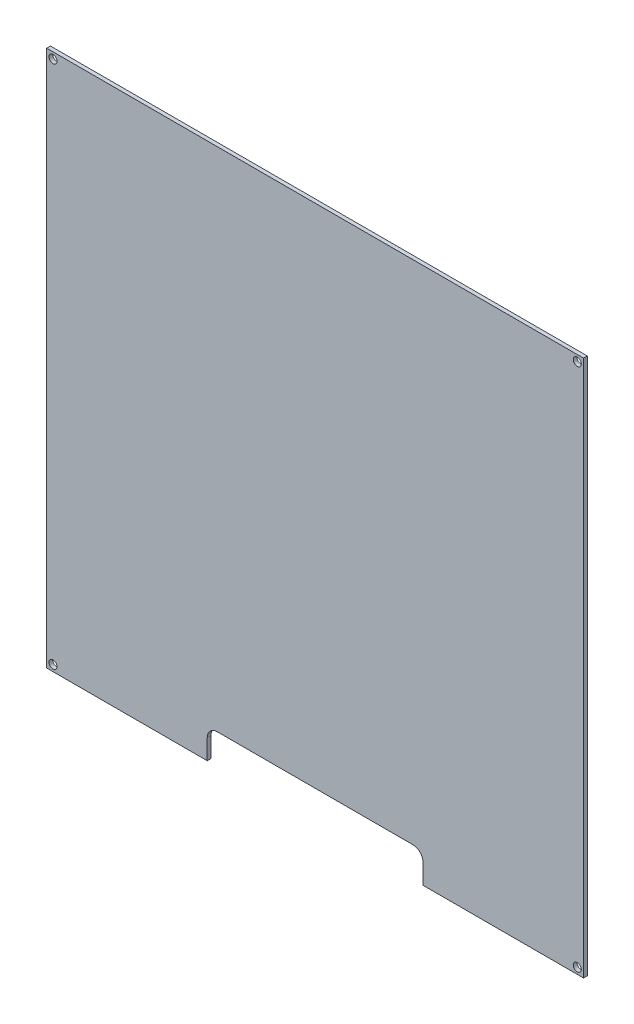
ISO-10303-21;
HEADER;
FILE_DESCRIPTION(('STEP AP214'),'2;1');
FILE_NAME('part.step','',(''),(''),'','','');
FILE_SCHEMA(('AUTOMOTIVE_DESIGN { 1 0 10303 214 1 1 1 1 }'));
ENDSEC;
DATA;
#1=APPLICATION_CONTEXT('core data for automotive mechanical design processes');
#2=APPLICATION_PROTOCOL_DEFINITION('international standard','automotive_design',2000,#1);
#3=PRODUCT_CONTEXT('',#1,'mechanical');
#4=PRODUCT('Part','Part','',(#3));
#5=PRODUCT_RELATED_PRODUCT_CATEGORY('part','',(#4));
#6=PRODUCT_DEFINITION_FORMATION('','',#4);
#7=PRODUCT_DEFINITION_CONTEXT('part definition',#1,'design');
#8=PRODUCT_DEFINITION('design','',#6,#7);
#9=PRODUCT_DEFINITION_SHAPE('','',#8);
#10=(LENGTH_UNIT() NAMED_UNIT(*) SI_UNIT(.MILLI.,.METRE.));
#11=(NAMED_UNIT(*) PLANE_ANGLE_UNIT() SI_UNIT($,.RADIAN.));
#12=(NAMED_UNIT(*) SI_UNIT($,.STERADIAN.) SOLID_ANGLE_UNIT());
#13=UNCERTAINTY_MEASURE_WITH_UNIT(LENGTH_MEASURE(1.E-05),#10,'distance_accuracy_value','');
#14=(GEOMETRIC_REPRESENTATION_CONTEXT(3) GLOBAL_UNCERTAINTY_ASSIGNED_CONTEXT((#13)) GLOBAL_UNIT_ASSIGNED_CONTEXT((#10,
#11,#12)) REPRESENTATION_CONTEXT('',''));
#15=CARTESIAN_POINT('',(0.,0.,0.));
#16=DIRECTION('',(0.,0.,1.));
#17=DIRECTION('',(1.,0.,0.));
#18=AXIS2_PLACEMENT_3D('',#15,#16,#17);
#19=CARTESIAN_POINT('',(-107.,-107.,1.5));
#20=DIRECTION('',(0.,1.,0.));
#21=DIRECTION('',(0.,0.,1.));
#22=AXIS2_PLACEMENT_3D('',#19,#20,#21);
#23=PLANE('',#22);
#24=DIRECTION('',(1.,0.,0.));
#25=VECTOR('',#24,1.);
#26=CARTESIAN_POINT('',(-107.,-107.,0.));
#27=LINE('',#26,#25);
#28=CARTESIAN_POINT('',(-107.,-107.,0.));
#29=VERTEX_POINT('',#28);
#30=CARTESIAN_POINT('',(-43.,-107.,0.));
#31=VERTEX_POINT('',#30);
#32=EDGE_CURVE('E114',#29,#31,#27,.T.);
#33=ORIENTED_EDGE('',*,*,#32,.T.);
#34=DIRECTION('',(0.,0.,1.));
#35=VECTOR('',#34,1.);
#36=CARTESIAN_POINT('',(-43.,-107.,0.));
#37=LINE('',#36,#35);
#38=CARTESIAN_POINT('',(-43.,-107.,1.5));
#39=VERTEX_POINT('',#38);
#40=EDGE_CURVE('E120',#31,#39,#37,.T.);
#41=ORIENTED_EDGE('',*,*,#40,.T.);
#42=DIRECTION('',(1.,0.,0.));
#43=VECTOR('',#42,1.);
#44=CARTESIAN_POINT('',(-107.,-107.,1.5));
#45=LINE('',#44,#43);
#46=CARTESIAN_POINT('',(-107.,-107.,1.5));
#47=VERTEX_POINT('',#46);
#48=EDGE_CURVE('E146',#47,#39,#45,.T.);
#49=ORIENTED_EDGE('',*,*,#48,.F.);
#50=DIRECTION('',(0.,0.,-1.));
#51=VECTOR('',#50,1.);
#52=CARTESIAN_POINT('',(-107.,-107.,1.5));
#53=LINE('',#52,#51);
#54=EDGE_CURVE('E132',#47,#29,#53,.T.);
#55=ORIENTED_EDGE('',*,*,#54,.T.);
#56=EDGE_LOOP('',(#33,#41,#49,#55));
#57=FACE_BOUND('',#56,.T.);
#58=ADVANCED_FACE('F34',(#57),#23,.F.);
#59=CARTESIAN_POINT('',(0.,0.,1.5));
#60=DIRECTION('',(0.,0.,-1.));
#61=DIRECTION('',(-1.,0.,0.));
#62=AXIS2_PLACEMENT_3D('',#59,#60,#61);
#63=PLANE('',#62);
#64=CARTESIAN_POINT('',(104.5,-104.5,1.5));
#65=DIRECTION('',(0.,0.,1.));
#66=DIRECTION('',(-1.,0.,0.));
#67=AXIS2_PLACEMENT_3D('',#64,#65,#66);
#68=CIRCLE('',#67,1.60000000000001);
#69=CARTESIAN_POINT('',(102.9,-104.5,1.5));
#70=VERTEX_POINT('',#69);
#71=EDGE_CURVE('E240',#70,#70,#68,.T.);
#72=ORIENTED_EDGE('',*,*,#71,.F.);
#73=EDGE_LOOP('',(#72));
#74=FACE_BOUND('',#73,.T.);
#75=CARTESIAN_POINT('',(104.5,104.5,1.5));
#76=DIRECTION('',(0.,0.,1.));
#77=DIRECTION('',(1.,0.,0.));
#78=AXIS2_PLACEMENT_3D('',#75,#76,#77);
#79=CIRCLE('',#78,1.60000000000001);
#80=CARTESIAN_POINT('',(106.1,104.5,1.5));
#81=VERTEX_POINT('',#80);
#82=EDGE_CURVE('E234',#81,#81,#79,.T.);
#83=ORIENTED_EDGE('',*,*,#82,.F.);
#84=EDGE_LOOP('',(#83));
#85=FACE_BOUND('',#84,.T.);
#86=ORIENTED_EDGE('',*,*,#48,.T.);
#87=DIRECTION('',(0.,-1.,0.));
#88=VECTOR('',#87,1.);
#89=CARTESIAN_POINT('',(-43.,-107.,1.5));
#90=LINE('',#89,#88);
#91=CARTESIAN_POINT('',(-43.,-99.,1.5));
#92=VERTEX_POINT('',#91);
#93=EDGE_CURVE('E123',#92,#39,#90,.T.);
#94=ORIENTED_EDGE('',*,*,#93,.F.);
#95=CARTESIAN_POINT('',(-39.,-99.,1.5));
#96=DIRECTION('',(0.,0.,-1.));
#97=DIRECTION('',(-1.,0.,0.));
#98=AXIS2_PLACEMENT_3D('',#95,#96,#97);
#99=CIRCLE('',#98,4.);
#100=CARTESIAN_POINT('',(-39.,-95.,1.5));
#101=VERTEX_POINT('',#100);
#102=EDGE_CURVE('E42',#92,#101,#99,.T.);
#103=ORIENTED_EDGE('',*,*,#102,.T.);
#104=DIRECTION('',(-1.,0.,0.));
#105=VECTOR('',#104,1.);
#106=CARTESIAN_POINT('',(-43.,-95.,1.5));
#107=LINE('',#106,#105);
#108=CARTESIAN_POINT('',(39.,-95.,1.5));
#109=VERTEX_POINT('',#108);
#110=EDGE_CURVE('E117',#109,#101,#107,.T.);
#111=ORIENTED_EDGE('',*,*,#110,.F.);
#112=CARTESIAN_POINT('',(39.,-99.,1.5));
#113=DIRECTION('',(0.,0.,-1.));
#114=DIRECTION('',(-1.,0.,0.));
#115=AXIS2_PLACEMENT_3D('',#112,#113,#114);
#116=CIRCLE('',#115,4.);
#117=CARTESIAN_POINT('',(43.,-99.,1.5));
#118=VERTEX_POINT('',#117);
#119=EDGE_CURVE('E163',#109,#118,#116,.T.);
#120=ORIENTED_EDGE('',*,*,#119,.T.);
#121=DIRECTION('',(0.,1.,0.));
#122=VECTOR('',#121,1.);
#123=CARTESIAN_POINT('',(43.,-107.,1.5));
#124=LINE('',#123,#122);
#125=CARTESIAN_POINT('',(43.,-107.,1.5));
#126=VERTEX_POINT('',#125);
#127=EDGE_CURVE('E175',#126,#118,#124,.T.);
#128=ORIENTED_EDGE('',*,*,#127,.F.);
#129=CARTESIAN_POINT('',(107.,-107.,1.5));
#130=VERTEX_POINT('',#129);
#131=EDGE_CURVE('E210',#126,#130,#45,.T.);
#132=ORIENTED_EDGE('',*,*,#131,.T.);
#133=DIRECTION('',(0.,1.,0.));
#134=VECTOR('',#133,1.);
#135=CARTESIAN_POINT('',(107.,-107.,1.5));
#136=LINE('',#135,#134);
#137=CARTESIAN_POINT('',(107.,107.,1.5));
#138=VERTEX_POINT('',#137);
#139=EDGE_CURVE('E133',#130,#138,#136,.T.);
#140=ORIENTED_EDGE('',*,*,#139,.T.);
#141=DIRECTION('',(-1.,0.,0.));
#142=VECTOR('',#141,1.);
#143=CARTESIAN_POINT('',(-107.,107.,1.5));
#144=LINE('',#143,#142);
#145=CARTESIAN_POINT('',(-107.,107.,1.5));
#146=VERTEX_POINT('',#145);
#147=EDGE_CURVE('E137',#138,#146,#144,.T.);
#148=ORIENTED_EDGE('',*,*,#147,.T.);
#149=DIRECTION('',(0.,-1.,0.));
#150=VECTOR('',#149,1.);
#151=CARTESIAN_POINT('',(-107.,-107.,1.5));
#152=LINE('',#151,#150);
#153=EDGE_CURVE('E214',#146,#47,#152,.T.);
#154=ORIENTED_EDGE('',*,*,#153,.T.);
#155=EDGE_LOOP('',(#86,#94,#103,#111,#120,#128,#132,#140,#148,#154));
#156=FACE_BOUND('',#155,.T.);
#157=CARTESIAN_POINT('',(-104.5,104.5,1.5));
#158=DIRECTION('',(0.,0.,1.));
#159=DIRECTION('',(1.,0.,0.));
#160=AXIS2_PLACEMENT_3D('',#157,#158,#159);
#161=CIRCLE('',#160,1.60000000000001);
#162=CARTESIAN_POINT('',(-102.9,104.5,1.5));
#163=VERTEX_POINT('',#162);
#164=EDGE_CURVE('E222',#163,#163,#161,.T.);
#165=ORIENTED_EDGE('',*,*,#164,.F.);
#166=EDGE_LOOP('',(#165));
#167=FACE_BOUND('',#166,.T.);
#168=CARTESIAN_POINT('',(-104.5,-104.5,1.5));
#169=DIRECTION('',(0.,0.,1.));
#170=DIRECTION('',(-1.,0.,0.));
#171=AXIS2_PLACEMENT_3D('',#168,#169,#170);
#172=CIRCLE('',#171,1.60000000000001);
#173=CARTESIAN_POINT('',(-106.1,-104.5,1.5));
#174=VERTEX_POINT('',#173);
#175=EDGE_CURVE('E246',#174,#174,#172,.T.);
#176=ORIENTED_EDGE('',*,*,#175,.F.);
#177=EDGE_LOOP('',(#176));
#178=FACE_BOUND('',#177,.T.);
#179=ADVANCED_FACE('F169',(#74,#85,#156,#167,#178),#63,.F.);
#180=CARTESIAN_POINT('',(0.,0.,0.));
#181=DIRECTION('',(0.,0.,-1.));
#182=DIRECTION('',(-1.,0.,0.));
#183=AXIS2_PLACEMENT_3D('',#180,#181,#182);
#184=PLANE('',#183);
#185=DIRECTION('',(-1.,0.,0.));
#186=VECTOR('',#185,1.);
#187=CARTESIAN_POINT('',(-43.,-95.,0.));
#188=LINE('',#187,#186);
#189=CARTESIAN_POINT('',(39.,-95.,0.));
#190=VERTEX_POINT('',#189);
#191=CARTESIAN_POINT('',(-39.,-95.,0.));
#192=VERTEX_POINT('',#191);
#193=EDGE_CURVE('E128',#190,#192,#188,.T.);
#194=ORIENTED_EDGE('',*,*,#193,.T.);
#195=CARTESIAN_POINT('',(-39.,-99.,0.));
#196=DIRECTION('',(0.,0.,-1.));
#197=DIRECTION('',(-1.,0.,0.));
#198=AXIS2_PLACEMENT_3D('',#195,#196,#197);
#199=CIRCLE('',#198,4.);
#200=CARTESIAN_POINT('',(-43.,-99.,0.));
#201=VERTEX_POINT('',#200);
#202=EDGE_CURVE('E11',#192,#201,#199,.F.);
#203=ORIENTED_EDGE('',*,*,#202,.T.);
#204=DIRECTION('',(0.,-1.,0.));
#205=VECTOR('',#204,1.);
#206=CARTESIAN_POINT('',(-43.,-107.,0.));
#207=LINE('',#206,#205);
#208=EDGE_CURVE('E108',#201,#31,#207,.T.);
#209=ORIENTED_EDGE('',*,*,#208,.T.);
#210=ORIENTED_EDGE('',*,*,#32,.F.);
#211=DIRECTION('',(0.,-1.,0.));
#212=VECTOR('',#211,1.);
#213=CARTESIAN_POINT('',(-107.,-107.,0.));
#214=LINE('',#213,#212);
#215=CARTESIAN_POINT('',(-107.,107.,0.));
#216=VERTEX_POINT('',#215);
#217=EDGE_CURVE('E139',#216,#29,#214,.T.);
#218=ORIENTED_EDGE('',*,*,#217,.F.);
#219=DIRECTION('',(-1.,0.,0.));
#220=VECTOR('',#219,1.);
#221=CARTESIAN_POINT('',(-107.,107.,0.));
#222=LINE('',#221,#220);
#223=CARTESIAN_POINT('',(107.,107.,0.));
#224=VERTEX_POINT('',#223);
#225=EDGE_CURVE('E221',#224,#216,#222,.T.);
#226=ORIENTED_EDGE('',*,*,#225,.F.);
#227=DIRECTION('',(0.,1.,0.));
#228=VECTOR('',#227,1.);
#229=CARTESIAN_POINT('',(107.,-107.,0.));
#230=LINE('',#229,#228);
#231=CARTESIAN_POINT('',(107.,-107.,0.));
#232=VERTEX_POINT('',#231);
#233=EDGE_CURVE('E219',#232,#224,#230,.T.);
#234=ORIENTED_EDGE('',*,*,#233,.F.);
#235=CARTESIAN_POINT('',(43.,-107.,0.));
#236=VERTEX_POINT('',#235);
#237=EDGE_CURVE('E134',#236,#232,#27,.T.);
#238=ORIENTED_EDGE('',*,*,#237,.F.);
#239=DIRECTION('',(0.,1.,0.));
#240=VECTOR('',#239,1.);
#241=CARTESIAN_POINT('',(43.,-107.,0.));
#242=LINE('',#241,#240);
#243=CARTESIAN_POINT('',(43.,-99.,0.));
#244=VERTEX_POINT('',#243);
#245=EDGE_CURVE('E116',#236,#244,#242,.T.);
#246=ORIENTED_EDGE('',*,*,#245,.T.);
#247=CARTESIAN_POINT('',(39.,-99.,0.));
#248=DIRECTION('',(0.,0.,-1.));
#249=DIRECTION('',(-1.,0.,0.));
#250=AXIS2_PLACEMENT_3D('',#247,#248,#249);
#251=CIRCLE('',#250,4.);
#252=EDGE_CURVE('E165',#244,#190,#251,.F.);
#253=ORIENTED_EDGE('',*,*,#252,.T.);
#254=EDGE_LOOP('',(#194,#203,#209,#210,#218,#226,#234,#238,#246,#253));
#255=FACE_BOUND('',#254,.T.);
#256=CARTESIAN_POINT('',(104.5,-104.5,0.));
#257=DIRECTION('',(0.,0.,1.));
#258=DIRECTION('',(-1.,0.,0.));
#259=AXIS2_PLACEMENT_3D('',#256,#257,#258);
#260=CIRCLE('',#259,1.60000000000001);
#261=CARTESIAN_POINT('',(102.9,-104.5,0.));
#262=VERTEX_POINT('',#261);
#263=EDGE_CURVE('E243',#262,#262,#260,.T.);
#264=ORIENTED_EDGE('',*,*,#263,.T.);
#265=EDGE_LOOP('',(#264));
#266=FACE_BOUND('',#265,.T.);
#267=CARTESIAN_POINT('',(104.5,104.5,0.));
#268=DIRECTION('',(0.,0.,1.));
#269=DIRECTION('',(1.,0.,0.));
#270=AXIS2_PLACEMENT_3D('',#267,#268,#269);
#271=CIRCLE('',#270,1.60000000000001);
#272=CARTESIAN_POINT('',(106.1,104.5,0.));
#273=VERTEX_POINT('',#272);
#274=EDGE_CURVE('E237',#273,#273,#271,.T.);
#275=ORIENTED_EDGE('',*,*,#274,.T.);
#276=EDGE_LOOP('',(#275));
#277=FACE_BOUND('',#276,.T.);
#278=CARTESIAN_POINT('',(-104.5,104.5,0.));
#279=DIRECTION('',(0.,0.,1.));
#280=DIRECTION('',(1.,0.,0.));
#281=AXIS2_PLACEMENT_3D('',#278,#279,#280);
#282=CIRCLE('',#281,1.60000000000001);
#283=CARTESIAN_POINT('',(-102.9,104.5,0.));
#284=VERTEX_POINT('',#283);
#285=EDGE_CURVE('E231',#284,#284,#282,.T.);
#286=ORIENTED_EDGE('',*,*,#285,.T.);
#287=EDGE_LOOP('',(#286));
#288=FACE_BOUND('',#287,.T.);
#289=CARTESIAN_POINT('',(-104.5,-104.5,0.));
#290=DIRECTION('',(0.,0.,1.));
#291=DIRECTION('',(-1.,0.,0.));
#292=AXIS2_PLACEMENT_3D('',#289,#290,#291);
#293=CIRCLE('',#292,1.60000000000001);
#294=CARTESIAN_POINT('',(-106.1,-104.5,0.));
#295=VERTEX_POINT('',#294);
#296=EDGE_CURVE('E249',#295,#295,#293,.T.);
#297=ORIENTED_EDGE('',*,*,#296,.T.);
#298=EDGE_LOOP('',(#297));
#299=FACE_BOUND('',#298,.T.);
#300=ADVANCED_FACE('F110',(#255,#266,#277,#288,#299),#184,.T.);
#301=CARTESIAN_POINT('',(107.,-107.,1.5));
#302=DIRECTION('',(-1.,0.,0.));
#303=DIRECTION('',(0.,0.,1.));
#304=AXIS2_PLACEMENT_3D('',#301,#302,#303);
#305=PLANE('',#304);
#306=ORIENTED_EDGE('',*,*,#233,.T.);
#307=DIRECTION('',(0.,0.,-1.));
#308=VECTOR('',#307,1.);
#309=CARTESIAN_POINT('',(107.,107.,1.5));
#310=LINE('',#309,#308);
#311=EDGE_CURVE('E151',#138,#224,#310,.T.);
#312=ORIENTED_EDGE('',*,*,#311,.F.);
#313=ORIENTED_EDGE('',*,*,#139,.F.);
#314=DIRECTION('',(0.,0.,-1.));
#315=VECTOR('',#314,1.);
#316=CARTESIAN_POINT('',(107.,-107.,1.5));
#317=LINE('',#316,#315);
#318=EDGE_CURVE('E143',#130,#232,#317,.T.);
#319=ORIENTED_EDGE('',*,*,#318,.T.);
#320=EDGE_LOOP('',(#306,#312,#313,#319));
#321=FACE_BOUND('',#320,.T.);
#322=ADVANCED_FACE('F229',(#321),#305,.F.);
#323=CARTESIAN_POINT('',(-107.,107.,1.5));
#324=DIRECTION('',(0.,-1.,0.));
#325=DIRECTION('',(0.,0.,-1.));
#326=AXIS2_PLACEMENT_3D('',#323,#324,#325);
#327=PLANE('',#326);
#328=ORIENTED_EDGE('',*,*,#225,.T.);
#329=DIRECTION('',(0.,0.,-1.));
#330=VECTOR('',#329,1.);
#331=CARTESIAN_POINT('',(-107.,107.,1.5));
#332=LINE('',#331,#330);
#333=EDGE_CURVE('E148',#146,#216,#332,.T.);
#334=ORIENTED_EDGE('',*,*,#333,.F.);
#335=ORIENTED_EDGE('',*,*,#147,.F.);
#336=ORIENTED_EDGE('',*,*,#311,.T.);
#337=EDGE_LOOP('',(#328,#334,#335,#336));
#338=FACE_BOUND('',#337,.T.);
#339=ADVANCED_FACE('F205',(#338),#327,.F.);
#340=CARTESIAN_POINT('',(-107.,-107.,1.5));
#341=DIRECTION('',(1.,0.,0.));
#342=DIRECTION('',(0.,0.,-1.));
#343=AXIS2_PLACEMENT_3D('',#340,#341,#342);
#344=PLANE('',#343);
#345=ORIENTED_EDGE('',*,*,#217,.T.);
#346=ORIENTED_EDGE('',*,*,#54,.F.);
#347=ORIENTED_EDGE('',*,*,#153,.F.);
#348=ORIENTED_EDGE('',*,*,#333,.T.);
#349=EDGE_LOOP('',(#345,#346,#347,#348));
#350=FACE_BOUND('',#349,.T.);
#351=ADVANCED_FACE('F196',(#350),#344,.F.);
#352=ORIENTED_EDGE('',*,*,#131,.F.);
#353=DIRECTION('',(0.,0.,1.));
#354=VECTOR('',#353,1.);
#355=CARTESIAN_POINT('',(43.,-107.,0.));
#356=LINE('',#355,#354);
#357=EDGE_CURVE('E127',#236,#126,#356,.T.);
#358=ORIENTED_EDGE('',*,*,#357,.F.);
#359=ORIENTED_EDGE('',*,*,#237,.T.);
#360=ORIENTED_EDGE('',*,*,#318,.F.);
#361=EDGE_LOOP('',(#352,#358,#359,#360));
#362=FACE_BOUND('',#361,.T.);
#363=ADVANCED_FACE('F186',(#362),#23,.F.);
#364=CARTESIAN_POINT('',(-104.5,104.5,1.5));
#365=DIRECTION('',(0.,0.,-1.));
#366=DIRECTION('',(-1.,0.,0.));
#367=AXIS2_PLACEMENT_3D('',#364,#365,#366);
#368=CYLINDRICAL_SURFACE('',#367,1.60000000000001);
#369=ORIENTED_EDGE('',*,*,#164,.T.);
#370=EDGE_LOOP('',(#369));
#371=FACE_BOUND('',#370,.T.);
#372=ORIENTED_EDGE('',*,*,#285,.F.);
#373=EDGE_LOOP('',(#372));
#374=FACE_BOUND('',#373,.T.);
#375=ADVANCED_FACE('F195',(#371,#374),#368,.F.);
#376=CARTESIAN_POINT('',(104.5,104.5,1.5));
#377=DIRECTION('',(0.,0.,-1.));
#378=DIRECTION('',(-1.,0.,0.));
#379=AXIS2_PLACEMENT_3D('',#376,#377,#378);
#380=CYLINDRICAL_SURFACE('',#379,1.60000000000001);
#381=ORIENTED_EDGE('',*,*,#82,.T.);
#382=EDGE_LOOP('',(#381));
#383=FACE_BOUND('',#382,.T.);
#384=ORIENTED_EDGE('',*,*,#274,.F.);
#385=EDGE_LOOP('',(#384));
#386=FACE_BOUND('',#385,.T.);
#387=ADVANCED_FACE('F202',(#383,#386),#380,.F.);
#388=CARTESIAN_POINT('',(104.5,-104.5,1.5));
#389=DIRECTION('',(0.,0.,-1.));
#390=DIRECTION('',(-1.,0.,0.));
#391=AXIS2_PLACEMENT_3D('',#388,#389,#390);
#392=CYLINDRICAL_SURFACE('',#391,1.60000000000001);
#393=ORIENTED_EDGE('',*,*,#71,.T.);
#394=EDGE_LOOP('',(#393));
#395=FACE_BOUND('',#394,.T.);
#396=ORIENTED_EDGE('',*,*,#263,.F.);
#397=EDGE_LOOP('',(#396));
#398=FACE_BOUND('',#397,.T.);
#399=ADVANCED_FACE('F275',(#395,#398),#392,.F.);
#400=CARTESIAN_POINT('',(-104.5,-104.5,1.5));
#401=DIRECTION('',(0.,0.,-1.));
#402=DIRECTION('',(-1.,0.,0.));
#403=AXIS2_PLACEMENT_3D('',#400,#401,#402);
#404=CYLINDRICAL_SURFACE('',#403,1.60000000000001);
#405=ORIENTED_EDGE('',*,*,#175,.T.);
#406=EDGE_LOOP('',(#405));
#407=FACE_BOUND('',#406,.T.);
#408=ORIENTED_EDGE('',*,*,#296,.F.);
#409=EDGE_LOOP('',(#408));
#410=FACE_BOUND('',#409,.T.);
#411=ADVANCED_FACE('F272',(#407,#410),#404,.F.);
#412=CARTESIAN_POINT('',(-43.,-107.,0.));
#413=DIRECTION('',(-1.,0.,0.));
#414=DIRECTION('',(0.,-1.,0.));
#415=AXIS2_PLACEMENT_3D('',#412,#413,#414);
#416=PLANE('',#415);
#417=ORIENTED_EDGE('',*,*,#208,.F.);
#418=DIRECTION('',(0.,0.,1.));
#419=VECTOR('',#418,1.);
#420=CARTESIAN_POINT('',(-43.,-99.,1.5));
#421=LINE('',#420,#419);
#422=EDGE_CURVE('E161',#201,#92,#421,.T.);
#423=ORIENTED_EDGE('',*,*,#422,.T.);
#424=ORIENTED_EDGE('',*,*,#93,.T.);
#425=ORIENTED_EDGE('',*,*,#40,.F.);
#426=EDGE_LOOP('',(#417,#423,#424,#425));
#427=FACE_BOUND('',#426,.T.);
#428=ADVANCED_FACE('F121',(#427),#416,.F.);
#429=CARTESIAN_POINT('',(-43.,-95.,0.));
#430=DIRECTION('',(0.,1.,0.));
#431=DIRECTION('',(0.,0.,1.));
#432=AXIS2_PLACEMENT_3D('',#429,#430,#431);
#433=PLANE('',#432);
#434=ORIENTED_EDGE('',*,*,#193,.F.);
#435=DIRECTION('',(0.,0.,1.));
#436=VECTOR('',#435,1.);
#437=CARTESIAN_POINT('',(39.,-95.,1.5));
#438=LINE('',#437,#436);
#439=EDGE_CURVE('E156',#190,#109,#438,.T.);
#440=ORIENTED_EDGE('',*,*,#439,.T.);
#441=ORIENTED_EDGE('',*,*,#110,.T.);
#442=DIRECTION('',(0.,0.,1.));
#443=VECTOR('',#442,1.);
#444=CARTESIAN_POINT('',(-39.,-95.,0.));
#445=LINE('',#444,#443);
#446=EDGE_CURVE('E154',#101,#192,#445,.F.);
#447=ORIENTED_EDGE('',*,*,#446,.T.);
#448=EDGE_LOOP('',(#434,#440,#441,#447));
#449=FACE_BOUND('',#448,.T.);
#450=ADVANCED_FACE('F173',(#449),#433,.F.);
#451=CARTESIAN_POINT('',(43.,-107.,0.));
#452=DIRECTION('',(1.,0.,0.));
#453=DIRECTION('',(0.,1.,0.));
#454=AXIS2_PLACEMENT_3D('',#451,#452,#453);
#455=PLANE('',#454);
#456=ORIENTED_EDGE('',*,*,#127,.T.);
#457=DIRECTION('',(0.,0.,1.));
#458=VECTOR('',#457,1.);
#459=CARTESIAN_POINT('',(43.,-99.,0.));
#460=LINE('',#459,#458);
#461=EDGE_CURVE('E159',#118,#244,#460,.F.);
#462=ORIENTED_EDGE('',*,*,#461,.T.);
#463=ORIENTED_EDGE('',*,*,#245,.F.);
#464=ORIENTED_EDGE('',*,*,#357,.T.);
#465=EDGE_LOOP('',(#456,#462,#463,#464));
#466=FACE_BOUND('',#465,.T.);
#467=ADVANCED_FACE('F182',(#466),#455,.F.);
#468=CARTESIAN_POINT('',(39.,-99.,0.));
#469=DIRECTION('',(0.,0.,-1.));
#470=DIRECTION('',(-1.,0.,0.));
#471=AXIS2_PLACEMENT_3D('',#468,#469,#470);
#472=CYLINDRICAL_SURFACE('',#471,4.);
#473=ORIENTED_EDGE('',*,*,#252,.F.);
#474=ORIENTED_EDGE('',*,*,#461,.F.);
#475=ORIENTED_EDGE('',*,*,#119,.F.);
#476=ORIENTED_EDGE('',*,*,#439,.F.);
#477=EDGE_LOOP('',(#473,#474,#475,#476));
#478=FACE_BOUND('',#477,.T.);
#479=ADVANCED_FACE('F178',(#478),#472,.F.);
#480=CARTESIAN_POINT('',(-39.,-99.,0.));
#481=DIRECTION('',(0.,0.,-1.));
#482=DIRECTION('',(-1.,0.,0.));
#483=AXIS2_PLACEMENT_3D('',#480,#481,#482);
#484=CYLINDRICAL_SURFACE('',#483,4.);
#485=ORIENTED_EDGE('',*,*,#202,.F.);
#486=ORIENTED_EDGE('',*,*,#446,.F.);
#487=ORIENTED_EDGE('',*,*,#102,.F.);
#488=ORIENTED_EDGE('',*,*,#422,.F.);
#489=EDGE_LOOP('',(#485,#486,#487,#488));
#490=FACE_BOUND('',#489,.T.);
#491=ADVANCED_FACE('F36',(#490),#484,.F.);
#492=CLOSED_SHELL('',(#58,#179,#300,#322,#339,#351,#363,#375,#387,#399,#411,#428,#450,#467,#479,#491));
#493=MANIFOLD_SOLID_BREP('B2',#492);
#494=ADVANCED_BREP_SHAPE_REPRESENTATION('',(#18,#493),#14);
#495=SHAPE_DEFINITION_REPRESENTATION(#9,#494);
ENDSEC;
END-ISO-10303-21;
